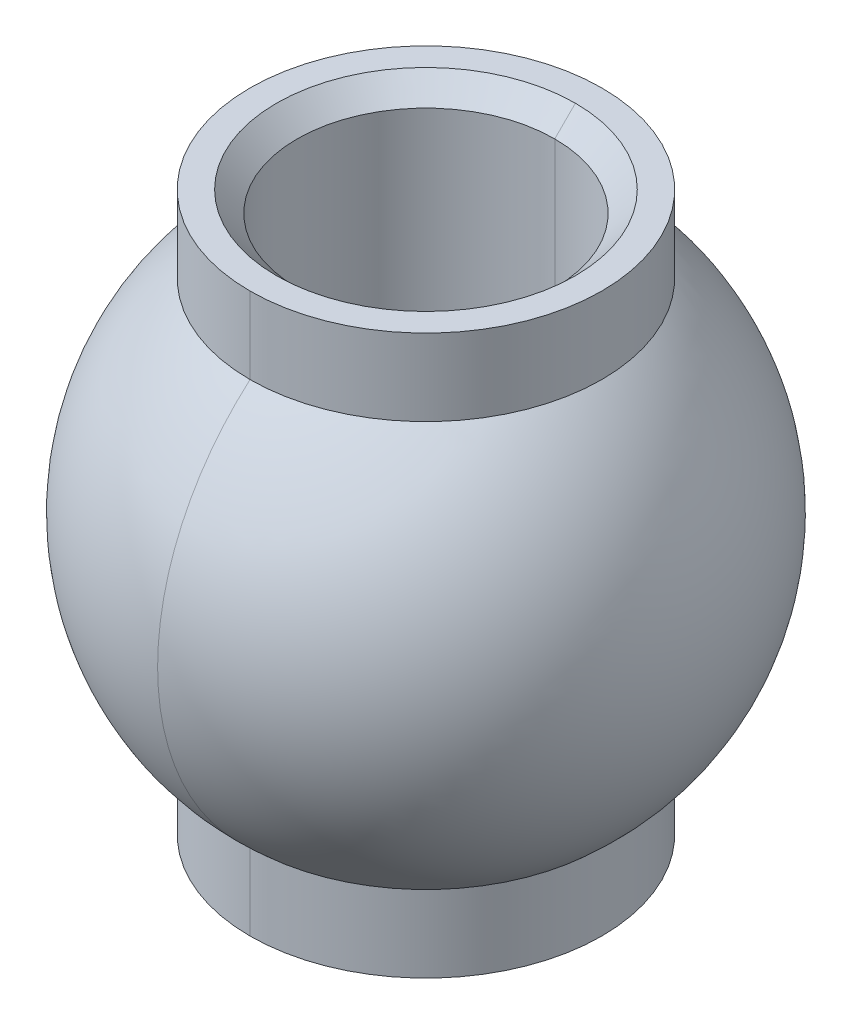
ISO-10303-21;
HEADER;
FILE_DESCRIPTION(('STEP AP214'),'2;1');
FILE_NAME('part.step','',(''),(''),'','','');
FILE_SCHEMA(('AUTOMOTIVE_DESIGN { 1 0 10303 214 1 1 1 1 }'));
ENDSEC;
DATA;
#1=APPLICATION_CONTEXT('core data for automotive mechanical design processes');
#2=APPLICATION_PROTOCOL_DEFINITION('international standard','automotive_design',2000,#1);
#3=PRODUCT_CONTEXT('',#1,'mechanical');
#4=PRODUCT('Part','Part','',(#3));
#5=PRODUCT_RELATED_PRODUCT_CATEGORY('part','',(#4));
#6=PRODUCT_DEFINITION_FORMATION('','',#4);
#7=PRODUCT_DEFINITION_CONTEXT('part definition',#1,'design');
#8=PRODUCT_DEFINITION('design','',#6,#7);
#9=PRODUCT_DEFINITION_SHAPE('','',#8);
#10=(LENGTH_UNIT() NAMED_UNIT(*) SI_UNIT(.MILLI.,.METRE.));
#11=(NAMED_UNIT(*) PLANE_ANGLE_UNIT() SI_UNIT($,.RADIAN.));
#12=(NAMED_UNIT(*) SI_UNIT($,.STERADIAN.) SOLID_ANGLE_UNIT());
#13=UNCERTAINTY_MEASURE_WITH_UNIT(LENGTH_MEASURE(1.E-05),#10,'distance_accuracy_value','');
#14=(GEOMETRIC_REPRESENTATION_CONTEXT(3) GLOBAL_UNCERTAINTY_ASSIGNED_CONTEXT((#13)) GLOBAL_UNIT_ASSIGNED_CONTEXT((#10,
#11,#12)) REPRESENTATION_CONTEXT('',''));
#15=CARTESIAN_POINT('',(0.,0.,0.));
#16=DIRECTION('',(0.,0.,1.));
#17=DIRECTION('',(1.,0.,0.));
#18=AXIS2_PLACEMENT_3D('',#15,#16,#17);
#19=CARTESIAN_POINT('',(0.,0.,0.));
#20=DIRECTION('',(0.,0.,1.));
#21=DIRECTION('',(1.,0.,0.));
#22=AXIS2_PLACEMENT_3D('',#19,#20,#21);
#23=SPHERICAL_SURFACE('',#22,9.9187);
#24=CARTESIAN_POINT('',(0.,0.,0.));
#25=DIRECTION('',(1.,0.,0.));
#26=DIRECTION('',(0.,0.,1.));
#27=AXIS2_PLACEMENT_3D('',#24,#25,#26);
#28=CIRCLE('',#27,9.9187);
#29=CARTESIAN_POINT('',(0.,-7.4899535332337,-6.5024));
#30=VERTEX_POINT('',#29);
#31=CARTESIAN_POINT('',(0.,0.,-9.9187));
#32=VERTEX_POINT('',#31);
#33=EDGE_CURVE('E217',#30,#32,#28,.T.);
#34=ORIENTED_EDGE('',*,*,#33,.T.);
#35=CARTESIAN_POINT('',(0.,0.,0.));
#36=DIRECTION('',(1.,0.,0.));
#37=DIRECTION('',(0.,0.,1.));
#38=AXIS2_PLACEMENT_3D('',#35,#36,#37);
#39=CIRCLE('',#38,9.9187);
#40=CARTESIAN_POINT('',(0.,7.4899535332337,-6.5024));
#41=VERTEX_POINT('',#40);
#42=EDGE_CURVE('E11',#32,#41,#39,.T.);
#43=ORIENTED_EDGE('',*,*,#42,.T.);
#44=CARTESIAN_POINT('',(0.,7.4899535332337,0.));
#45=DIRECTION('',(0.,-1.,0.));
#46=DIRECTION('',(0.,0.,-1.));
#47=AXIS2_PLACEMENT_3D('',#44,#45,#46);
#48=CIRCLE('',#47,6.5024);
#49=CARTESIAN_POINT('',(0.,7.4899535332337,6.5024));
#50=VERTEX_POINT('',#49);
#51=EDGE_CURVE('E171',#41,#50,#48,.T.);
#52=ORIENTED_EDGE('',*,*,#51,.T.);
#53=CARTESIAN_POINT('',(0.,0.,0.));
#54=DIRECTION('',(1.,0.,0.));
#55=DIRECTION('',(0.,0.,1.));
#56=AXIS2_PLACEMENT_3D('',#53,#54,#55);
#57=CIRCLE('',#56,9.9187);
#58=CARTESIAN_POINT('',(0.,0.,9.9187));
#59=VERTEX_POINT('',#58);
#60=EDGE_CURVE('E28',#50,#59,#57,.T.);
#61=ORIENTED_EDGE('',*,*,#60,.T.);
#62=CARTESIAN_POINT('',(0.,0.,0.));
#63=DIRECTION('',(1.,0.,0.));
#64=DIRECTION('',(0.,0.,1.));
#65=AXIS2_PLACEMENT_3D('',#62,#63,#64);
#66=CIRCLE('',#65,9.9187);
#67=CARTESIAN_POINT('',(0.,-7.48995353323371,6.5024));
#68=VERTEX_POINT('',#67);
#69=EDGE_CURVE('E21',#59,#68,#66,.T.);
#70=ORIENTED_EDGE('',*,*,#69,.T.);
#71=CARTESIAN_POINT('',(0.,-7.48995353323371,0.));
#72=DIRECTION('',(0.,1.,0.));
#73=DIRECTION('',(0.,0.,-1.));
#74=AXIS2_PLACEMENT_3D('',#71,#72,#73);
#75=CIRCLE('',#74,6.5024);
#76=EDGE_CURVE('E167',#68,#30,#75,.T.);
#77=ORIENTED_EDGE('',*,*,#76,.T.);
#78=EDGE_LOOP('',(#34,#43,#52,#61,#70,#77));
#79=FACE_BOUND('',#78,.T.);
#80=ADVANCED_FACE('F17',(#79),#23,.T.);
#81=CARTESIAN_POINT('',(0.,0.,0.));
#82=DIRECTION('',(0.,0.,1.));
#83=DIRECTION('',(1.,0.,0.));
#84=AXIS2_PLACEMENT_3D('',#81,#82,#83);
#85=SPHERICAL_SURFACE('',#84,9.9187);
#86=ORIENTED_EDGE('',*,*,#33,.F.);
#87=CARTESIAN_POINT('',(0.,-7.48995353323371,0.));
#88=DIRECTION('',(0.,1.,0.));
#89=DIRECTION('',(0.,0.,-1.));
#90=AXIS2_PLACEMENT_3D('',#87,#88,#89);
#91=CIRCLE('',#90,6.5024);
#92=EDGE_CURVE('E172',#30,#68,#91,.T.);
#93=ORIENTED_EDGE('',*,*,#92,.T.);
#94=ORIENTED_EDGE('',*,*,#69,.F.);
#95=ORIENTED_EDGE('',*,*,#60,.F.);
#96=CARTESIAN_POINT('',(0.,7.4899535332337,0.));
#97=DIRECTION('',(0.,-1.,0.));
#98=DIRECTION('',(0.,0.,-1.));
#99=AXIS2_PLACEMENT_3D('',#96,#97,#98);
#100=CIRCLE('',#99,6.5024);
#101=EDGE_CURVE('E134',#50,#41,#100,.T.);
#102=ORIENTED_EDGE('',*,*,#101,.T.);
#103=ORIENTED_EDGE('',*,*,#42,.F.);
#104=EDGE_LOOP('',(#86,#93,#94,#95,#102,#103));
#105=FACE_BOUND('',#104,.T.);
#106=ADVANCED_FACE('F236',(#105),#85,.T.);
#107=CARTESIAN_POINT('',(0.,0.,0.));
#108=DIRECTION('',(0.,1.,0.));
#109=DIRECTION('',(0.,0.,-1.));
#110=AXIS2_PLACEMENT_3D('',#107,#108,#109);
#111=CYLINDRICAL_SURFACE('',#110,6.5024);
#112=DIRECTION('',(0.,1.,0.));
#113=VECTOR('',#112,1.);
#114=CARTESIAN_POINT('',(0.,0.,-6.5024));
#115=LINE('',#114,#113);
#116=CARTESIAN_POINT('',(0.,10.3251,-6.5024));
#117=VERTEX_POINT('',#116);
#118=EDGE_CURVE('E142',#41,#117,#115,.T.);
#119=ORIENTED_EDGE('',*,*,#118,.T.);
#120=CARTESIAN_POINT('',(0.,10.3251,0.));
#121=DIRECTION('',(0.,1.,0.));
#122=DIRECTION('',(0.,0.,-1.));
#123=AXIS2_PLACEMENT_3D('',#120,#121,#122);
#124=CIRCLE('',#123,6.5024);
#125=CARTESIAN_POINT('',(0.,10.3251,6.5024));
#126=VERTEX_POINT('',#125);
#127=EDGE_CURVE('E140',#126,#117,#124,.T.);
#128=ORIENTED_EDGE('',*,*,#127,.F.);
#129=DIRECTION('',(0.,-1.,0.));
#130=VECTOR('',#129,1.);
#131=CARTESIAN_POINT('',(0.,0.,6.5024));
#132=LINE('',#131,#130);
#133=EDGE_CURVE('E128',#126,#50,#132,.T.);
#134=ORIENTED_EDGE('',*,*,#133,.T.);
#135=ORIENTED_EDGE('',*,*,#51,.F.);
#136=EDGE_LOOP('',(#119,#128,#134,#135));
#137=FACE_BOUND('',#136,.T.);
#138=ADVANCED_FACE('F141',(#137),#111,.T.);
#139=CARTESIAN_POINT('',(0.,0.,0.));
#140=DIRECTION('',(0.,1.,0.));
#141=DIRECTION('',(0.,0.,-1.));
#142=AXIS2_PLACEMENT_3D('',#139,#140,#141);
#143=CYLINDRICAL_SURFACE('',#142,6.5024);
#144=DIRECTION('',(0.,1.,0.));
#145=VECTOR('',#144,1.);
#146=CARTESIAN_POINT('',(0.,0.,-6.5024));
#147=LINE('',#146,#145);
#148=CARTESIAN_POINT('',(0.,-10.3251,-6.5024));
#149=VERTEX_POINT('',#148);
#150=EDGE_CURVE('E137',#149,#30,#147,.T.);
#151=ORIENTED_EDGE('',*,*,#150,.T.);
#152=ORIENTED_EDGE('',*,*,#76,.F.);
#153=DIRECTION('',(0.,-1.,0.));
#154=VECTOR('',#153,1.);
#155=CARTESIAN_POINT('',(0.,0.,6.5024));
#156=LINE('',#155,#154);
#157=CARTESIAN_POINT('',(0.,-10.3251,6.5024));
#158=VERTEX_POINT('',#157);
#159=EDGE_CURVE('E196',#68,#158,#156,.T.);
#160=ORIENTED_EDGE('',*,*,#159,.T.);
#161=CARTESIAN_POINT('',(0.,-10.3251,0.));
#162=DIRECTION('',(0.,-1.,0.));
#163=DIRECTION('',(0.,0.,-1.));
#164=AXIS2_PLACEMENT_3D('',#161,#162,#163);
#165=CIRCLE('',#164,6.5024);
#166=EDGE_CURVE('E157',#149,#158,#165,.T.);
#167=ORIENTED_EDGE('',*,*,#166,.F.);
#168=EDGE_LOOP('',(#151,#152,#160,#167));
#169=FACE_BOUND('',#168,.T.);
#170=ADVANCED_FACE('F306',(#169),#143,.T.);
#171=CARTESIAN_POINT('',(0.,0.,0.));
#172=DIRECTION('',(0.,1.,0.));
#173=DIRECTION('',(0.,0.,-1.));
#174=AXIS2_PLACEMENT_3D('',#171,#172,#173);
#175=CYLINDRICAL_SURFACE('',#174,6.5024);
#176=ORIENTED_EDGE('',*,*,#150,.F.);
#177=CARTESIAN_POINT('',(0.,-10.3251,0.));
#178=DIRECTION('',(0.,-1.,0.));
#179=DIRECTION('',(0.,0.,-1.));
#180=AXIS2_PLACEMENT_3D('',#177,#178,#179);
#181=CIRCLE('',#180,6.5024);
#182=EDGE_CURVE('E149',#158,#149,#181,.T.);
#183=ORIENTED_EDGE('',*,*,#182,.F.);
#184=ORIENTED_EDGE('',*,*,#159,.F.);
#185=ORIENTED_EDGE('',*,*,#92,.F.);
#186=EDGE_LOOP('',(#176,#183,#184,#185));
#187=FACE_BOUND('',#186,.T.);
#188=ADVANCED_FACE('F316',(#187),#175,.T.);
#189=CARTESIAN_POINT('',(0.,0.,0.));
#190=DIRECTION('',(0.,1.,0.));
#191=DIRECTION('',(0.,0.,-1.));
#192=AXIS2_PLACEMENT_3D('',#189,#190,#191);
#193=CYLINDRICAL_SURFACE('',#192,6.5024);
#194=ORIENTED_EDGE('',*,*,#118,.F.);
#195=ORIENTED_EDGE('',*,*,#101,.F.);
#196=ORIENTED_EDGE('',*,*,#133,.F.);
#197=CARTESIAN_POINT('',(0.,10.3251,0.));
#198=DIRECTION('',(0.,1.,0.));
#199=DIRECTION('',(0.,0.,-1.));
#200=AXIS2_PLACEMENT_3D('',#197,#198,#199);
#201=CIRCLE('',#200,6.5024);
#202=EDGE_CURVE('E132',#117,#126,#201,.T.);
#203=ORIENTED_EDGE('',*,*,#202,.F.);
#204=EDGE_LOOP('',(#194,#195,#196,#203));
#205=FACE_BOUND('',#204,.T.);
#206=ADVANCED_FACE('F19',(#205),#193,.T.);
#207=CARTESIAN_POINT('',(0.,10.3251,0.));
#208=DIRECTION('',(0.,1.,0.));
#209=DIRECTION('',(1.,0.,0.));
#210=AXIS2_PLACEMENT_3D('',#207,#208,#209);
#211=PLANE('',#210);
#212=ORIENTED_EDGE('',*,*,#202,.T.);
#213=ORIENTED_EDGE('',*,*,#127,.T.);
#214=EDGE_LOOP('',(#212,#213));
#215=FACE_BOUND('',#214,.T.);
#216=CARTESIAN_POINT('',(0.,10.3251,0.));
#217=DIRECTION('',(0.,-1.,0.));
#218=DIRECTION('',(0.,0.,-1.));
#219=AXIS2_PLACEMENT_3D('',#216,#217,#218);
#220=CIRCLE('',#219,5.5245);
#221=CARTESIAN_POINT('',(0.,10.3251,-5.5245));
#222=VERTEX_POINT('',#221);
#223=CARTESIAN_POINT('',(0.,10.3251,5.5245));
#224=VERTEX_POINT('',#223);
#225=EDGE_CURVE('E162',#222,#224,#220,.T.);
#226=ORIENTED_EDGE('',*,*,#225,.T.);
#227=CARTESIAN_POINT('',(0.,10.3251,0.));
#228=DIRECTION('',(0.,-1.,0.));
#229=DIRECTION('',(0.,0.,-1.));
#230=AXIS2_PLACEMENT_3D('',#227,#228,#229);
#231=CIRCLE('',#230,5.5245);
#232=EDGE_CURVE('E181',#224,#222,#231,.T.);
#233=ORIENTED_EDGE('',*,*,#232,.T.);
#234=EDGE_LOOP('',(#226,#233));
#235=FACE_BOUND('',#234,.T.);
#236=ADVANCED_FACE('F146',(#215,#235),#211,.T.);
#237=CARTESIAN_POINT('',(0.,-10.3251,0.));
#238=DIRECTION('',(0.,-1.,0.));
#239=DIRECTION('',(0.,0.,-1.));
#240=AXIS2_PLACEMENT_3D('',#237,#238,#239);
#241=PLANE('',#240);
#242=ORIENTED_EDGE('',*,*,#166,.T.);
#243=ORIENTED_EDGE('',*,*,#182,.T.);
#244=EDGE_LOOP('',(#242,#243));
#245=FACE_BOUND('',#244,.T.);
#246=CARTESIAN_POINT('',(0.,-10.3251,0.));
#247=DIRECTION('',(0.,1.,0.));
#248=DIRECTION('',(0.,0.,-1.));
#249=AXIS2_PLACEMENT_3D('',#246,#247,#248);
#250=CIRCLE('',#249,5.5245);
#251=CARTESIAN_POINT('',(0.,-10.3251,-5.5245));
#252=VERTEX_POINT('',#251);
#253=CARTESIAN_POINT('',(0.,-10.3251,5.5245));
#254=VERTEX_POINT('',#253);
#255=EDGE_CURVE('E94',#252,#254,#250,.T.);
#256=ORIENTED_EDGE('',*,*,#255,.T.);
#257=CARTESIAN_POINT('',(0.,-10.3251,0.));
#258=DIRECTION('',(0.,1.,0.));
#259=DIRECTION('',(0.,0.,-1.));
#260=AXIS2_PLACEMENT_3D('',#257,#258,#259);
#261=CIRCLE('',#260,5.5245);
#262=EDGE_CURVE('E184',#254,#252,#261,.T.);
#263=ORIENTED_EDGE('',*,*,#262,.T.);
#264=EDGE_LOOP('',(#256,#263));
#265=FACE_BOUND('',#264,.T.);
#266=ADVANCED_FACE('F254',(#245,#265),#241,.T.);
#267=CARTESIAN_POINT('',(0.,9.9441,0.));
#268=DIRECTION('',(0.,1.,0.));
#269=DIRECTION('',(0.,0.,-1.));
#270=AXIS2_PLACEMENT_3D('',#267,#268,#269);
#271=CONICAL_SURFACE('',#270,5.1435,0.785398163397448);
#272=DIRECTION('',(0.,0.707106781186547,-0.707106781186548));
#273=VECTOR('',#272,1.);
#274=CARTESIAN_POINT('',(0.,9.9441,-5.1435));
#275=LINE('',#274,#273);
#276=CARTESIAN_POINT('',(0.,9.5631,-4.7625));
#277=VERTEX_POINT('',#276);
#278=EDGE_CURVE('E207',#277,#222,#275,.T.);
#279=ORIENTED_EDGE('',*,*,#278,.F.);
#280=CARTESIAN_POINT('',(0.,9.5631,0.));
#281=DIRECTION('',(0.,1.,0.));
#282=DIRECTION('',(0.,0.,-1.));
#283=AXIS2_PLACEMENT_3D('',#280,#281,#282);
#284=CIRCLE('',#283,4.7625);
#285=CARTESIAN_POINT('',(0.,9.5631,4.7625));
#286=VERTEX_POINT('',#285);
#287=EDGE_CURVE('E192',#286,#277,#284,.T.);
#288=ORIENTED_EDGE('',*,*,#287,.F.);
#289=DIRECTION('',(0.,-0.707106781186547,-0.707106781186548));
#290=VECTOR('',#289,1.);
#291=CARTESIAN_POINT('',(0.,9.9441,5.1435));
#292=LINE('',#291,#290);
#293=EDGE_CURVE('E164',#224,#286,#292,.T.);
#294=ORIENTED_EDGE('',*,*,#293,.F.);
#295=ORIENTED_EDGE('',*,*,#225,.F.);
#296=EDGE_LOOP('',(#279,#288,#294,#295));
#297=FACE_BOUND('',#296,.T.);
#298=ADVANCED_FACE('F248',(#297),#271,.F.);
#299=CARTESIAN_POINT('',(0.,9.9441,0.));
#300=DIRECTION('',(0.,1.,0.));
#301=DIRECTION('',(0.,0.,-1.));
#302=AXIS2_PLACEMENT_3D('',#299,#300,#301);
#303=CONICAL_SURFACE('',#302,5.1435,0.785398163397448);
#304=ORIENTED_EDGE('',*,*,#278,.T.);
#305=ORIENTED_EDGE('',*,*,#232,.F.);
#306=ORIENTED_EDGE('',*,*,#293,.T.);
#307=CARTESIAN_POINT('',(0.,9.5631,0.));
#308=DIRECTION('',(0.,1.,0.));
#309=DIRECTION('',(0.,0.,-1.));
#310=AXIS2_PLACEMENT_3D('',#307,#308,#309);
#311=CIRCLE('',#310,4.7625);
#312=EDGE_CURVE('E199',#277,#286,#311,.T.);
#313=ORIENTED_EDGE('',*,*,#312,.F.);
#314=EDGE_LOOP('',(#304,#305,#306,#313));
#315=FACE_BOUND('',#314,.T.);
#316=ADVANCED_FACE('F253',(#315),#303,.F.);
#317=CARTESIAN_POINT('',(0.,-9.9441,0.));
#318=DIRECTION('',(0.,-1.,0.));
#319=DIRECTION('',(0.,0.,-1.));
#320=AXIS2_PLACEMENT_3D('',#317,#318,#319);
#321=CONICAL_SURFACE('',#320,5.1435,0.785398163397448);
#322=DIRECTION('',(0.,-0.707106781186547,-0.707106781186548));
#323=VECTOR('',#322,1.);
#324=CARTESIAN_POINT('',(0.,-9.9441,-5.1435));
#325=LINE('',#324,#323);
#326=CARTESIAN_POINT('',(0.,-9.5631,-4.7625));
#327=VERTEX_POINT('',#326);
#328=EDGE_CURVE('E161',#327,#252,#325,.T.);
#329=ORIENTED_EDGE('',*,*,#328,.F.);
#330=CARTESIAN_POINT('',(0.,-9.5631,0.));
#331=DIRECTION('',(0.,-1.,0.));
#332=DIRECTION('',(0.,0.,-1.));
#333=AXIS2_PLACEMENT_3D('',#330,#331,#332);
#334=CIRCLE('',#333,4.7625);
#335=CARTESIAN_POINT('',(0.,-9.5631,4.7625));
#336=VERTEX_POINT('',#335);
#337=EDGE_CURVE('E173',#336,#327,#334,.T.);
#338=ORIENTED_EDGE('',*,*,#337,.F.);
#339=DIRECTION('',(0.,0.707106781186547,-0.707106781186548));
#340=VECTOR('',#339,1.);
#341=CARTESIAN_POINT('',(0.,-9.9441,5.1435));
#342=LINE('',#341,#340);
#343=EDGE_CURVE('E107',#254,#336,#342,.T.);
#344=ORIENTED_EDGE('',*,*,#343,.F.);
#345=ORIENTED_EDGE('',*,*,#255,.F.);
#346=EDGE_LOOP('',(#329,#338,#344,#345));
#347=FACE_BOUND('',#346,.T.);
#348=ADVANCED_FACE('F268',(#347),#321,.F.);
#349=CARTESIAN_POINT('',(0.,-9.9441,0.));
#350=DIRECTION('',(0.,-1.,0.));
#351=DIRECTION('',(0.,0.,-1.));
#352=AXIS2_PLACEMENT_3D('',#349,#350,#351);
#353=CONICAL_SURFACE('',#352,5.1435,0.785398163397448);
#354=ORIENTED_EDGE('',*,*,#328,.T.);
#355=ORIENTED_EDGE('',*,*,#262,.F.);
#356=ORIENTED_EDGE('',*,*,#343,.T.);
#357=CARTESIAN_POINT('',(0.,-9.5631,0.));
#358=DIRECTION('',(0.,-1.,0.));
#359=DIRECTION('',(0.,0.,-1.));
#360=AXIS2_PLACEMENT_3D('',#357,#358,#359);
#361=CIRCLE('',#360,4.7625);
#362=EDGE_CURVE('E177',#327,#336,#361,.T.);
#363=ORIENTED_EDGE('',*,*,#362,.F.);
#364=EDGE_LOOP('',(#354,#355,#356,#363));
#365=FACE_BOUND('',#364,.T.);
#366=ADVANCED_FACE('F263',(#365),#353,.F.);
#367=CARTESIAN_POINT('',(0.,0.,0.));
#368=DIRECTION('',(0.,1.,0.));
#369=DIRECTION('',(0.,0.,-1.));
#370=AXIS2_PLACEMENT_3D('',#367,#368,#369);
#371=CYLINDRICAL_SURFACE('',#370,4.7625);
#372=DIRECTION('',(0.,-1.,0.));
#373=VECTOR('',#372,1.);
#374=CARTESIAN_POINT('',(0.,0.,-4.7625));
#375=LINE('',#374,#373);
#376=EDGE_CURVE('E202',#277,#327,#375,.T.);
#377=ORIENTED_EDGE('',*,*,#376,.T.);
#378=ORIENTED_EDGE('',*,*,#362,.T.);
#379=DIRECTION('',(0.,1.,0.));
#380=VECTOR('',#379,1.);
#381=CARTESIAN_POINT('',(0.,0.,4.7625));
#382=LINE('',#381,#380);
#383=EDGE_CURVE('E178',#336,#286,#382,.T.);
#384=ORIENTED_EDGE('',*,*,#383,.T.);
#385=ORIENTED_EDGE('',*,*,#287,.T.);
#386=EDGE_LOOP('',(#377,#378,#384,#385));
#387=FACE_BOUND('',#386,.T.);
#388=ADVANCED_FACE('F267',(#387),#371,.F.);
#389=CARTESIAN_POINT('',(0.,0.,0.));
#390=DIRECTION('',(0.,1.,0.));
#391=DIRECTION('',(0.,0.,-1.));
#392=AXIS2_PLACEMENT_3D('',#389,#390,#391);
#393=CYLINDRICAL_SURFACE('',#392,4.7625);
#394=ORIENTED_EDGE('',*,*,#376,.F.);
#395=ORIENTED_EDGE('',*,*,#312,.T.);
#396=ORIENTED_EDGE('',*,*,#383,.F.);
#397=ORIENTED_EDGE('',*,*,#337,.T.);
#398=EDGE_LOOP('',(#394,#395,#396,#397));
#399=FACE_BOUND('',#398,.T.);
#400=ADVANCED_FACE('F353',(#399),#393,.F.);
#401=CLOSED_SHELL('',(#80,#106,#138,#170,#188,#206,#236,#266,#298,#316,#348,#366,#388,#400));
#402=MANIFOLD_SOLID_BREP('B1',#401);
#403=ADVANCED_BREP_SHAPE_REPRESENTATION('',(#18,#402),#14);
#404=SHAPE_DEFINITION_REPRESENTATION(#9,#403);
ENDSEC;
END-ISO-10303-21;
